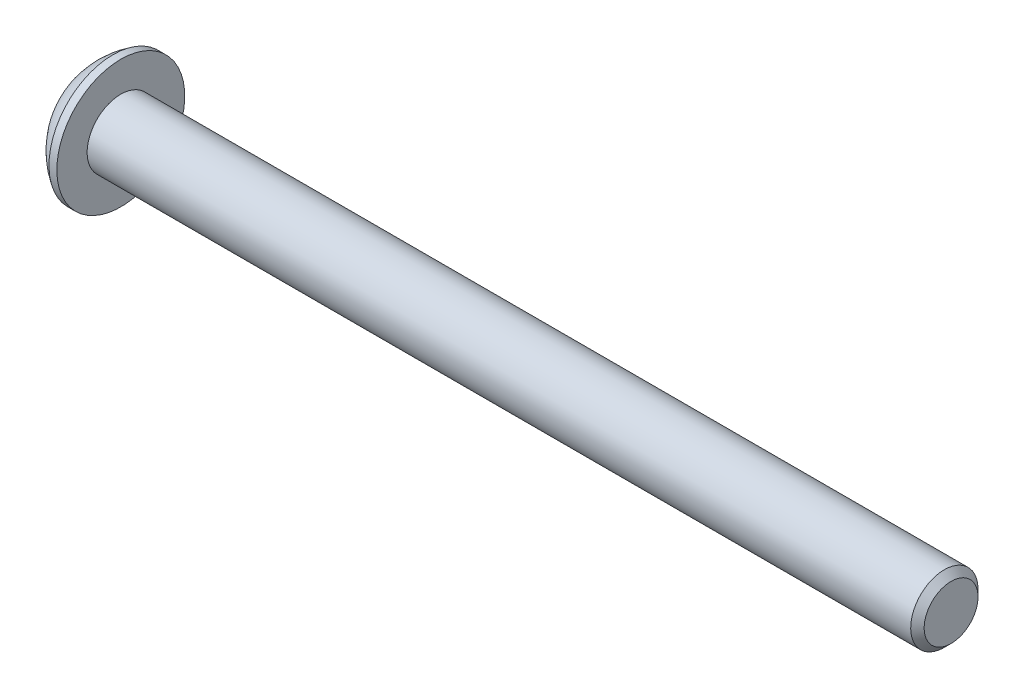
ISO-10303-21;
HEADER;
FILE_DESCRIPTION(('STEP AP214'),'2;1');
FILE_NAME('part.step','',(''),(''),'','','');
FILE_SCHEMA(('AUTOMOTIVE_DESIGN { 1 0 10303 214 1 1 1 1 }'));
ENDSEC;
DATA;
#1=APPLICATION_CONTEXT('core data for automotive mechanical design processes');
#2=APPLICATION_PROTOCOL_DEFINITION('international standard','automotive_design',2000,#1);
#3=PRODUCT_CONTEXT('',#1,'mechanical');
#4=PRODUCT('Part','Part','',(#3));
#5=PRODUCT_RELATED_PRODUCT_CATEGORY('part','',(#4));
#6=PRODUCT_DEFINITION_FORMATION('','',#4);
#7=PRODUCT_DEFINITION_CONTEXT('part definition',#1,'design');
#8=PRODUCT_DEFINITION('design','',#6,#7);
#9=PRODUCT_DEFINITION_SHAPE('','',#8);
#10=(LENGTH_UNIT() NAMED_UNIT(*) SI_UNIT(.MILLI.,.METRE.));
#11=(NAMED_UNIT(*) PLANE_ANGLE_UNIT() SI_UNIT($,.RADIAN.));
#12=(NAMED_UNIT(*) SI_UNIT($,.STERADIAN.) SOLID_ANGLE_UNIT());
#13=UNCERTAINTY_MEASURE_WITH_UNIT(LENGTH_MEASURE(1.E-05),#10,'distance_accuracy_value','');
#14=(GEOMETRIC_REPRESENTATION_CONTEXT(3) GLOBAL_UNCERTAINTY_ASSIGNED_CONTEXT((#13)) GLOBAL_UNIT_ASSIGNED_CONTEXT((#10,
#11,#12)) REPRESENTATION_CONTEXT('',''));
#15=CARTESIAN_POINT('',(0.,0.,0.));
#16=DIRECTION('',(0.,0.,1.));
#17=DIRECTION('',(1.,0.,0.));
#18=AXIS2_PLACEMENT_3D('',#15,#16,#17);
#19=CARTESIAN_POINT('',(38.65,1.50000000000001,0.));
#20=DIRECTION('',(1.,0.,0.));
#21=DIRECTION('',(0.,1.,0.));
#22=AXIS2_PLACEMENT_3D('',#19,#20,#21);
#23=PLANE('',#22);
#24=CARTESIAN_POINT('',(38.65,0.,0.));
#25=DIRECTION('',(1.,0.,0.));
#26=DIRECTION('',(0.,1.,0.));
#27=AXIS2_PLACEMENT_3D('',#24,#25,#26);
#28=CIRCLE('',#27,1.20000000000001);
#29=CARTESIAN_POINT('',(38.65,1.20000000000001,0.));
#30=VERTEX_POINT('',#29);
#31=EDGE_CURVE('E48',#30,#30,#28,.T.);
#32=ORIENTED_EDGE('',*,*,#31,.T.);
#33=EDGE_LOOP('',(#32));
#34=FACE_BOUND('',#33,.T.);
#35=ADVANCED_FACE('F39',(#34),#23,.T.);
#36=CARTESIAN_POINT('',(38.65,0.,0.));
#37=DIRECTION('',(1.,0.,0.));
#38=DIRECTION('',(0.,1.,0.));
#39=AXIS2_PLACEMENT_3D('',#36,#37,#38);
#40=CYLINDRICAL_SURFACE('',#39,1.5);
#41=CARTESIAN_POINT('',(38.35,0.,0.));
#42=DIRECTION('',(1.,0.,0.));
#43=DIRECTION('',(0.,1.,0.));
#44=AXIS2_PLACEMENT_3D('',#41,#42,#43);
#45=CIRCLE('',#44,1.5);
#46=CARTESIAN_POINT('',(38.35,1.50000000000001,0.));
#47=VERTEX_POINT('',#46);
#48=EDGE_CURVE('E11',#47,#47,#45,.F.);
#49=ORIENTED_EDGE('',*,*,#48,.T.);
#50=EDGE_LOOP('',(#49));
#51=FACE_BOUND('',#50,.T.);
#52=CARTESIAN_POINT('',(1.65,0.,0.));
#53=DIRECTION('',(1.,0.,0.));
#54=DIRECTION('',(0.,1.,0.));
#55=AXIS2_PLACEMENT_3D('',#52,#53,#54);
#56=CIRCLE('',#55,1.50000000000001);
#57=CARTESIAN_POINT('',(1.65,1.50000000000001,0.));
#58=VERTEX_POINT('',#57);
#59=EDGE_CURVE('E175',#58,#58,#56,.T.);
#60=ORIENTED_EDGE('',*,*,#59,.T.);
#61=EDGE_LOOP('',(#60));
#62=FACE_BOUND('',#61,.T.);
#63=ADVANCED_FACE('F198',(#51,#62),#40,.T.);
#64=CARTESIAN_POINT('',(1.65,2.85,0.));
#65=DIRECTION('',(1.,0.,0.));
#66=DIRECTION('',(0.,1.,0.));
#67=AXIS2_PLACEMENT_3D('',#64,#65,#66);
#68=PLANE('',#67);
#69=CARTESIAN_POINT('',(1.65,0.,0.));
#70=DIRECTION('',(1.,0.,0.));
#71=DIRECTION('',(0.,1.,0.));
#72=AXIS2_PLACEMENT_3D('',#69,#70,#71);
#73=CIRCLE('',#72,2.85);
#74=CARTESIAN_POINT('',(1.65,2.85,0.));
#75=VERTEX_POINT('',#74);
#76=EDGE_CURVE('E171',#75,#75,#73,.T.);
#77=ORIENTED_EDGE('',*,*,#76,.T.);
#78=EDGE_LOOP('',(#77));
#79=FACE_BOUND('',#78,.T.);
#80=ORIENTED_EDGE('',*,*,#59,.F.);
#81=EDGE_LOOP('',(#80));
#82=FACE_BOUND('',#81,.T.);
#83=ADVANCED_FACE('F202',(#79,#82),#68,.T.);
#84=CARTESIAN_POINT('',(38.65,0.,0.));
#85=DIRECTION('',(1.,0.,0.));
#86=DIRECTION('',(0.,1.,0.));
#87=AXIS2_PLACEMENT_3D('',#84,#85,#86);
#88=CYLINDRICAL_SURFACE('',#87,2.85);
#89=CARTESIAN_POINT('',(1.3,0.,0.));
#90=DIRECTION('',(1.,0.,0.));
#91=DIRECTION('',(0.,1.,0.));
#92=AXIS2_PLACEMENT_3D('',#89,#90,#91);
#93=CIRCLE('',#92,2.85);
#94=CARTESIAN_POINT('',(1.3,2.85,0.));
#95=VERTEX_POINT('',#94);
#96=EDGE_CURVE('E167',#95,#95,#93,.T.);
#97=ORIENTED_EDGE('',*,*,#96,.T.);
#98=EDGE_LOOP('',(#97));
#99=FACE_BOUND('',#98,.T.);
#100=ORIENTED_EDGE('',*,*,#76,.F.);
#101=EDGE_LOOP('',(#100));
#102=FACE_BOUND('',#101,.T.);
#103=ADVANCED_FACE('F208',(#99,#102),#88,.T.);
#104=CARTESIAN_POINT('',(3.13557647887669,0.,0.));
#105=DIRECTION('',(1.,0.,0.));
#106=DIRECTION('',(0.,1.,0.));
#107=AXIS2_PLACEMENT_3D('',#104,#105,#106);
#108=DEGENERATE_TOROIDAL_SURFACE('',#107,0.130043454413822,3.5,.F.);
#109=CARTESIAN_POINT('',(0.,0.,0.));
#110=DIRECTION('',(1.,0.,0.));
#111=DIRECTION('',(0.,1.,0.));
#112=AXIS2_PLACEMENT_3D('',#109,#110,#111);
#113=CIRCLE('',#112,1.425);
#114=CARTESIAN_POINT('',(0.,1.425,0.));
#115=VERTEX_POINT('',#114);
#116=EDGE_CURVE('E154',#115,#115,#113,.T.);
#117=ORIENTED_EDGE('',*,*,#116,.T.);
#118=EDGE_LOOP('',(#117));
#119=FACE_BOUND('',#118,.T.);
#120=ORIENTED_EDGE('',*,*,#96,.F.);
#121=EDGE_LOOP('',(#120));
#122=FACE_BOUND('',#121,.T.);
#123=ADVANCED_FACE('F193',(#119,#122),#108,.F.);
#124=CARTESIAN_POINT('',(0.,0.,0.));
#125=DIRECTION('',(-1.,0.,0.));
#126=DIRECTION('',(0.,-1.,0.));
#127=AXIS2_PLACEMENT_3D('',#124,#125,#126);
#128=PLANE('',#127);
#129=DIRECTION('',(0.,0.5,-0.866025403784439));
#130=VECTOR('',#129,1.);
#131=CARTESIAN_POINT('',(0.,0.577350269189626,1.));
#132=LINE('',#131,#130);
#133=CARTESIAN_POINT('',(0.,0.577350269189626,1.));
#134=VERTEX_POINT('',#133);
#135=CARTESIAN_POINT('',(0.,1.15470053837925,0.));
#136=VERTEX_POINT('',#135);
#137=EDGE_CURVE('E55',#134,#136,#132,.T.);
#138=ORIENTED_EDGE('',*,*,#137,.F.);
#139=DIRECTION('',(0.,1.,0.));
#140=VECTOR('',#139,1.);
#141=CARTESIAN_POINT('',(0.,-0.577350269189626,1.));
#142=LINE('',#141,#140);
#143=CARTESIAN_POINT('',(0.,-0.577350269189626,1.));
#144=VERTEX_POINT('',#143);
#145=EDGE_CURVE('E148',#144,#134,#142,.T.);
#146=ORIENTED_EDGE('',*,*,#145,.F.);
#147=DIRECTION('',(0.,0.5,0.866025403784439));
#148=VECTOR('',#147,1.);
#149=CARTESIAN_POINT('',(0.,-1.15470053837925,0.));
#150=LINE('',#149,#148);
#151=CARTESIAN_POINT('',(0.,-1.15470053837925,0.));
#152=VERTEX_POINT('',#151);
#153=EDGE_CURVE('E145',#152,#144,#150,.T.);
#154=ORIENTED_EDGE('',*,*,#153,.F.);
#155=DIRECTION('',(0.,-0.5,0.866025403784439));
#156=VECTOR('',#155,1.);
#157=CARTESIAN_POINT('',(0.,-0.577350269189626,-1.));
#158=LINE('',#157,#156);
#159=CARTESIAN_POINT('',(0.,-0.577350269189626,-1.));
#160=VERTEX_POINT('',#159);
#161=EDGE_CURVE('E103',#160,#152,#158,.T.);
#162=ORIENTED_EDGE('',*,*,#161,.F.);
#163=DIRECTION('',(0.,-1.,0.));
#164=VECTOR('',#163,1.);
#165=CARTESIAN_POINT('',(0.,0.577350269189626,-1.));
#166=LINE('',#165,#164);
#167=CARTESIAN_POINT('',(0.,0.577350269189626,-1.));
#168=VERTEX_POINT('',#167);
#169=EDGE_CURVE('E139',#168,#160,#166,.T.);
#170=ORIENTED_EDGE('',*,*,#169,.F.);
#171=DIRECTION('',(0.,-0.5,-0.866025403784439));
#172=VECTOR('',#171,1.);
#173=CARTESIAN_POINT('',(0.,1.15470053837925,0.));
#174=LINE('',#173,#172);
#175=EDGE_CURVE('E135',#136,#168,#174,.T.);
#176=ORIENTED_EDGE('',*,*,#175,.F.);
#177=EDGE_LOOP('',(#138,#146,#154,#162,#170,#176));
#178=FACE_BOUND('',#177,.T.);
#179=ORIENTED_EDGE('',*,*,#116,.F.);
#180=EDGE_LOOP('',(#179));
#181=FACE_BOUND('',#180,.T.);
#182=ADVANCED_FACE('F185',(#178,#181),#128,.T.);
#183=CARTESIAN_POINT('',(38.65,0.,0.));
#184=DIRECTION('',(-1.,0.,0.));
#185=DIRECTION('',(0.,-1.,0.));
#186=AXIS2_PLACEMENT_3D('',#183,#184,#185);
#187=CONICAL_SURFACE('',#186,1.20000000000001,0.785398163397445);
#188=ORIENTED_EDGE('',*,*,#48,.F.);
#189=EDGE_LOOP('',(#188));
#190=FACE_BOUND('',#189,.T.);
#191=ORIENTED_EDGE('',*,*,#31,.F.);
#192=EDGE_LOOP('',(#191));
#193=FACE_BOUND('',#192,.T.);
#194=ADVANCED_FACE('F41',(#190,#193),#187,.T.);
#195=CARTESIAN_POINT('',(1.,0.577350269189626,1.));
#196=DIRECTION('',(0.,0.866025403784439,0.5));
#197=DIRECTION('',(0.,-0.5,0.866025403784439));
#198=AXIS2_PLACEMENT_3D('',#195,#196,#197);
#199=PLANE('',#198);
#200=ORIENTED_EDGE('',*,*,#137,.T.);
#201=DIRECTION('',(-1.,0.,0.));
#202=VECTOR('',#201,1.);
#203=CARTESIAN_POINT('',(1.,1.15470053837925,0.));
#204=LINE('',#203,#202);
#205=CARTESIAN_POINT('',(1.,1.15470053837925,0.));
#206=VERTEX_POINT('',#205);
#207=EDGE_CURVE('E85',#206,#136,#204,.T.);
#208=ORIENTED_EDGE('',*,*,#207,.F.);
#209=DIRECTION('',(0.,0.5,-0.866025403784439));
#210=VECTOR('',#209,1.);
#211=CARTESIAN_POINT('',(1.,0.577350269189626,1.));
#212=LINE('',#211,#210);
#213=CARTESIAN_POINT('',(1.,0.577350269189626,1.));
#214=VERTEX_POINT('',#213);
#215=EDGE_CURVE('E151',#214,#206,#212,.T.);
#216=ORIENTED_EDGE('',*,*,#215,.F.);
#217=DIRECTION('',(-1.,0.,0.));
#218=VECTOR('',#217,1.);
#219=CARTESIAN_POINT('',(1.,0.577350269189626,1.));
#220=LINE('',#219,#218);
#221=EDGE_CURVE('E63',#214,#134,#220,.T.);
#222=ORIENTED_EDGE('',*,*,#221,.T.);
#223=EDGE_LOOP('',(#200,#208,#216,#222));
#224=FACE_BOUND('',#223,.T.);
#225=ADVANCED_FACE('F184',(#224),#199,.F.);
#226=CARTESIAN_POINT('',(1.,-0.577350269189626,1.));
#227=DIRECTION('',(0.,0.,1.));
#228=DIRECTION('',(0.,-1.,0.));
#229=AXIS2_PLACEMENT_3D('',#226,#227,#228);
#230=PLANE('',#229);
#231=ORIENTED_EDGE('',*,*,#145,.T.);
#232=ORIENTED_EDGE('',*,*,#221,.F.);
#233=DIRECTION('',(0.,1.,0.));
#234=VECTOR('',#233,1.);
#235=CARTESIAN_POINT('',(1.,-0.577350269189626,1.));
#236=LINE('',#235,#234);
#237=CARTESIAN_POINT('',(1.,-0.577350269189626,1.));
#238=VERTEX_POINT('',#237);
#239=EDGE_CURVE('E117',#238,#214,#236,.T.);
#240=ORIENTED_EDGE('',*,*,#239,.F.);
#241=DIRECTION('',(-1.,0.,0.));
#242=VECTOR('',#241,1.);
#243=CARTESIAN_POINT('',(1.,-0.577350269189626,1.));
#244=LINE('',#243,#242);
#245=EDGE_CURVE('E108',#238,#144,#244,.T.);
#246=ORIENTED_EDGE('',*,*,#245,.T.);
#247=EDGE_LOOP('',(#231,#232,#240,#246));
#248=FACE_BOUND('',#247,.T.);
#249=ADVANCED_FACE('F191',(#248),#230,.F.);
#250=CARTESIAN_POINT('',(1.,-1.15470053837925,0.));
#251=DIRECTION('',(0.,-0.866025403784439,0.5));
#252=DIRECTION('',(0.,-0.5,-0.866025403784439));
#253=AXIS2_PLACEMENT_3D('',#250,#251,#252);
#254=PLANE('',#253);
#255=ORIENTED_EDGE('',*,*,#153,.T.);
#256=ORIENTED_EDGE('',*,*,#245,.F.);
#257=DIRECTION('',(0.,0.5,0.866025403784439));
#258=VECTOR('',#257,1.);
#259=CARTESIAN_POINT('',(1.,-1.15470053837925,0.));
#260=LINE('',#259,#258);
#261=CARTESIAN_POINT('',(1.,-1.15470053837925,0.));
#262=VERTEX_POINT('',#261);
#263=EDGE_CURVE('E112',#262,#238,#260,.T.);
#264=ORIENTED_EDGE('',*,*,#263,.F.);
#265=DIRECTION('',(-1.,0.,0.));
#266=VECTOR('',#265,1.);
#267=CARTESIAN_POINT('',(1.,-1.15470053837925,0.));
#268=LINE('',#267,#266);
#269=EDGE_CURVE('E96',#262,#152,#268,.T.);
#270=ORIENTED_EDGE('',*,*,#269,.T.);
#271=EDGE_LOOP('',(#255,#256,#264,#270));
#272=FACE_BOUND('',#271,.T.);
#273=ADVANCED_FACE('F113',(#272),#254,.F.);
#274=CARTESIAN_POINT('',(1.,-0.577350269189626,-1.));
#275=DIRECTION('',(0.,-0.866025403784439,-0.5));
#276=DIRECTION('',(0.,0.5,-0.866025403784439));
#277=AXIS2_PLACEMENT_3D('',#274,#275,#276);
#278=PLANE('',#277);
#279=ORIENTED_EDGE('',*,*,#161,.T.);
#280=ORIENTED_EDGE('',*,*,#269,.F.);
#281=DIRECTION('',(0.,-0.5,0.866025403784439));
#282=VECTOR('',#281,1.);
#283=CARTESIAN_POINT('',(1.,-0.577350269189626,-1.));
#284=LINE('',#283,#282);
#285=CARTESIAN_POINT('',(1.,-0.577350269189626,-1.));
#286=VERTEX_POINT('',#285);
#287=EDGE_CURVE('E100',#286,#262,#284,.T.);
#288=ORIENTED_EDGE('',*,*,#287,.F.);
#289=DIRECTION('',(-1.,0.,0.));
#290=VECTOR('',#289,1.);
#291=CARTESIAN_POINT('',(1.,-0.577350269189626,-1.));
#292=LINE('',#291,#290);
#293=EDGE_CURVE('E109',#286,#160,#292,.T.);
#294=ORIENTED_EDGE('',*,*,#293,.T.);
#295=EDGE_LOOP('',(#279,#280,#288,#294));
#296=FACE_BOUND('',#295,.T.);
#297=ADVANCED_FACE('F98',(#296),#278,.F.);
#298=CARTESIAN_POINT('',(1.,0.577350269189626,-1.));
#299=DIRECTION('',(0.,0.,-1.));
#300=DIRECTION('',(-1.,0.,0.));
#301=AXIS2_PLACEMENT_3D('',#298,#299,#300);
#302=PLANE('',#301);
#303=ORIENTED_EDGE('',*,*,#169,.T.);
#304=ORIENTED_EDGE('',*,*,#293,.F.);
#305=DIRECTION('',(0.,-1.,0.));
#306=VECTOR('',#305,1.);
#307=CARTESIAN_POINT('',(1.,0.577350269189626,-1.));
#308=LINE('',#307,#306);
#309=CARTESIAN_POINT('',(1.,0.577350269189626,-1.));
#310=VERTEX_POINT('',#309);
#311=EDGE_CURVE('E123',#310,#286,#308,.T.);
#312=ORIENTED_EDGE('',*,*,#311,.F.);
#313=DIRECTION('',(-1.,0.,0.));
#314=VECTOR('',#313,1.);
#315=CARTESIAN_POINT('',(1.,0.577350269189626,-1.));
#316=LINE('',#315,#314);
#317=EDGE_CURVE('E159',#310,#168,#316,.T.);
#318=ORIENTED_EDGE('',*,*,#317,.T.);
#319=EDGE_LOOP('',(#303,#304,#312,#318));
#320=FACE_BOUND('',#319,.T.);
#321=ADVANCED_FACE('F219',(#320),#302,.F.);
#322=CARTESIAN_POINT('',(1.,1.15470053837925,0.));
#323=DIRECTION('',(0.,0.866025403784439,-0.5));
#324=DIRECTION('',(0.,0.5,0.866025403784439));
#325=AXIS2_PLACEMENT_3D('',#322,#323,#324);
#326=PLANE('',#325);
#327=ORIENTED_EDGE('',*,*,#175,.T.);
#328=ORIENTED_EDGE('',*,*,#317,.F.);
#329=DIRECTION('',(0.,-0.5,-0.866025403784439));
#330=VECTOR('',#329,1.);
#331=CARTESIAN_POINT('',(1.,1.15470053837925,0.));
#332=LINE('',#331,#330);
#333=EDGE_CURVE('E127',#206,#310,#332,.T.);
#334=ORIENTED_EDGE('',*,*,#333,.F.);
#335=ORIENTED_EDGE('',*,*,#207,.T.);
#336=EDGE_LOOP('',(#327,#328,#334,#335));
#337=FACE_BOUND('',#336,.T.);
#338=ADVANCED_FACE('F216',(#337),#326,.F.);
#339=CARTESIAN_POINT('',(1.,0.,0.));
#340=DIRECTION('',(-1.,0.,0.));
#341=DIRECTION('',(0.,-1.,0.));
#342=AXIS2_PLACEMENT_3D('',#339,#340,#341);
#343=PLANE('',#342);
#344=ORIENTED_EDGE('',*,*,#215,.T.);
#345=ORIENTED_EDGE('',*,*,#333,.T.);
#346=ORIENTED_EDGE('',*,*,#311,.T.);
#347=ORIENTED_EDGE('',*,*,#287,.T.);
#348=ORIENTED_EDGE('',*,*,#263,.T.);
#349=ORIENTED_EDGE('',*,*,#239,.T.);
#350=EDGE_LOOP('',(#344,#345,#346,#347,#348,#349));
#351=FACE_BOUND('',#350,.T.);
#352=ADVANCED_FACE('F120',(#351),#343,.T.);
#353=CLOSED_SHELL('',(#35,#63,#83,#103,#123,#182,#194,#225,#249,#273,#297,#321,#338,#352));
#354=MANIFOLD_SOLID_BREP('B2',#353);
#355=ADVANCED_BREP_SHAPE_REPRESENTATION('',(#18,#354),#14);
#356=SHAPE_DEFINITION_REPRESENTATION(#9,#355);
ENDSEC;
END-ISO-10303-21;
